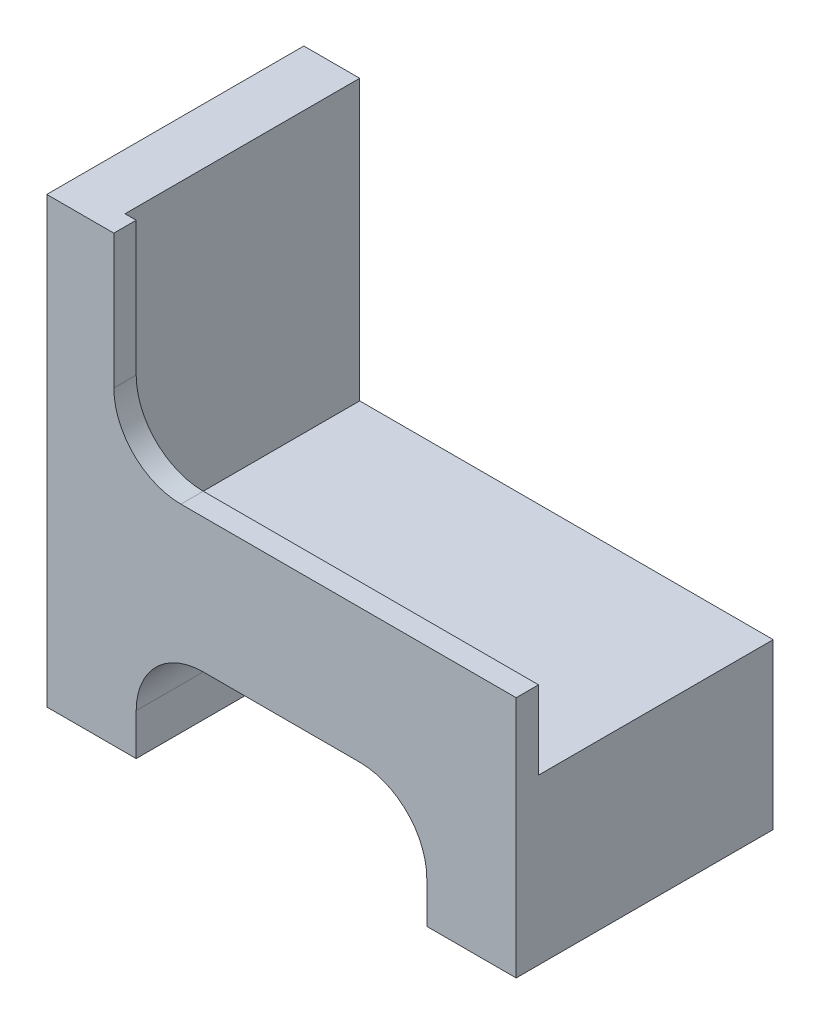
ISO-10303-21;
HEADER;
FILE_DESCRIPTION(('STEP AP214'),'2;1');
FILE_NAME('part.step','',(''),(''),'','','');
FILE_SCHEMA(('AUTOMOTIVE_DESIGN { 1 0 10303 214 1 1 1 1 }'));
ENDSEC;
DATA;
#1=APPLICATION_CONTEXT('core data for automotive mechanical design processes');
#2=APPLICATION_PROTOCOL_DEFINITION('international standard','automotive_design',2000,#1);
#3=PRODUCT_CONTEXT('',#1,'mechanical');
#4=PRODUCT('Part','Part','',(#3));
#5=PRODUCT_RELATED_PRODUCT_CATEGORY('part','',(#4));
#6=PRODUCT_DEFINITION_FORMATION('','',#4);
#7=PRODUCT_DEFINITION_CONTEXT('part definition',#1,'design');
#8=PRODUCT_DEFINITION('design','',#6,#7);
#9=PRODUCT_DEFINITION_SHAPE('','',#8);
#10=(LENGTH_UNIT() NAMED_UNIT(*) SI_UNIT(.MILLI.,.METRE.));
#11=(NAMED_UNIT(*) PLANE_ANGLE_UNIT() SI_UNIT($,.RADIAN.));
#12=(NAMED_UNIT(*) SI_UNIT($,.STERADIAN.) SOLID_ANGLE_UNIT());
#13=UNCERTAINTY_MEASURE_WITH_UNIT(LENGTH_MEASURE(1.E-05),#10,'distance_accuracy_value','');
#14=(GEOMETRIC_REPRESENTATION_CONTEXT(3) GLOBAL_UNCERTAINTY_ASSIGNED_CONTEXT((#13)) GLOBAL_UNIT_ASSIGNED_CONTEXT((#10,
#11,#12)) REPRESENTATION_CONTEXT('',''));
#15=CARTESIAN_POINT('',(0.,0.,0.));
#16=DIRECTION('',(0.,0.,1.));
#17=DIRECTION('',(1.,0.,0.));
#18=AXIS2_PLACEMENT_3D('',#15,#16,#17);
#19=CARTESIAN_POINT('',(0.,0.,10.));
#20=DIRECTION('',(-1.,0.,0.));
#21=DIRECTION('',(0.,0.,1.));
#22=AXIS2_PLACEMENT_3D('',#19,#20,#21);
#23=PLANE('',#22);
#24=DIRECTION('',(0.,-1.,0.));
#25=VECTOR('',#24,1.);
#26=CARTESIAN_POINT('',(0.,0.,10.5));
#27=LINE('',#26,#25);
#28=CARTESIAN_POINT('',(0.,12.,10.5));
#29=VERTEX_POINT('',#28);
#30=CARTESIAN_POINT('',(0.,6.,10.5));
#31=VERTEX_POINT('',#30);
#32=EDGE_CURVE('E57',#29,#31,#27,.T.);
#33=ORIENTED_EDGE('',*,*,#32,.F.);
#34=DIRECTION('',(0.,0.,-1.));
#35=VECTOR('',#34,1.);
#36=CARTESIAN_POINT('',(0.,12.,10.));
#37=LINE('',#36,#35);
#38=CARTESIAN_POINT('',(0.,12.,11.5));
#39=VERTEX_POINT('',#38);
#40=EDGE_CURVE('E303',#39,#29,#37,.T.);
#41=ORIENTED_EDGE('',*,*,#40,.F.);
#42=DIRECTION('',(0.,1.,0.));
#43=VECTOR('',#42,1.);
#44=CARTESIAN_POINT('',(0.,12.,11.5));
#45=LINE('',#44,#43);
#46=CARTESIAN_POINT('',(0.,6.,11.5));
#47=VERTEX_POINT('',#46);
#48=EDGE_CURVE('E241',#47,#39,#45,.T.);
#49=ORIENTED_EDGE('',*,*,#48,.F.);
#50=DIRECTION('',(0.,0.,-1.));
#51=VECTOR('',#50,1.);
#52=CARTESIAN_POINT('',(0.,6.,10.));
#53=LINE('',#52,#51);
#54=EDGE_CURVE('E343',#47,#31,#53,.T.);
#55=ORIENTED_EDGE('',*,*,#54,.T.);
#56=EDGE_LOOP('',(#33,#41,#49,#55));
#57=FACE_BOUND('',#56,.T.);
#58=ADVANCED_FACE('F41',(#57),#23,.F.);
#59=CARTESIAN_POINT('',(0.,3.,11.5));
#60=DIRECTION('',(0.,-1.,0.));
#61=DIRECTION('',(1.,0.,0.));
#62=AXIS2_PLACEMENT_3D('',#59,#60,#61);
#63=PLANE('',#62);
#64=DIRECTION('',(1.,0.,0.));
#65=VECTOR('',#64,1.);
#66=CARTESIAN_POINT('',(0.,3.,10.5));
#67=LINE('',#66,#65);
#68=CARTESIAN_POINT('',(3.,3.,10.5));
#69=VERTEX_POINT('',#68);
#70=CARTESIAN_POINT('',(18.,3.,10.5));
#71=VERTEX_POINT('',#70);
#72=EDGE_CURVE('E174',#69,#71,#67,.T.);
#73=ORIENTED_EDGE('',*,*,#72,.F.);
#74=DIRECTION('',(0.,0.,-1.));
#75=VECTOR('',#74,1.);
#76=CARTESIAN_POINT('',(3.,3.,11.5));
#77=LINE('',#76,#75);
#78=CARTESIAN_POINT('',(3.,3.,11.5));
#79=VERTEX_POINT('',#78);
#80=EDGE_CURVE('E65',#69,#79,#77,.F.);
#81=ORIENTED_EDGE('',*,*,#80,.T.);
#82=DIRECTION('',(-1.,0.,0.));
#83=VECTOR('',#82,1.);
#84=CARTESIAN_POINT('',(0.,3.,11.5));
#85=LINE('',#84,#83);
#86=CARTESIAN_POINT('',(18.,3.,11.5));
#87=VERTEX_POINT('',#86);
#88=EDGE_CURVE('E238',#87,#79,#85,.T.);
#89=ORIENTED_EDGE('',*,*,#88,.F.);
#90=DIRECTION('',(0.,0.,-1.));
#91=VECTOR('',#90,1.);
#92=CARTESIAN_POINT('',(18.,3.,11.5));
#93=LINE('',#92,#91);
#94=EDGE_CURVE('E244',#87,#71,#93,.T.);
#95=ORIENTED_EDGE('',*,*,#94,.T.);
#96=EDGE_LOOP('',(#73,#81,#89,#95));
#97=FACE_BOUND('',#96,.T.);
#98=ADVANCED_FACE('F354',(#97),#63,.F.);
#99=CARTESIAN_POINT('',(3.,6.,10.));
#100=DIRECTION('',(0.,0.,1.));
#101=DIRECTION('',(1.,0.,0.));
#102=AXIS2_PLACEMENT_3D('',#99,#100,#101);
#103=CYLINDRICAL_SURFACE('',#102,3.);
#104=CARTESIAN_POINT('',(3.,6.,10.5));
#105=DIRECTION('',(0.,0.,-1.));
#106=DIRECTION('',(-1.,0.,0.));
#107=AXIS2_PLACEMENT_3D('',#104,#105,#106);
#108=CIRCLE('',#107,3.);
#109=EDGE_CURVE('E50',#31,#69,#108,.F.);
#110=ORIENTED_EDGE('',*,*,#109,.F.);
#111=ORIENTED_EDGE('',*,*,#54,.F.);
#112=CARTESIAN_POINT('',(3.,6.,11.5));
#113=DIRECTION('',(0.,0.,1.));
#114=DIRECTION('',(1.,0.,0.));
#115=AXIS2_PLACEMENT_3D('',#112,#113,#114);
#116=CIRCLE('',#115,3.);
#117=EDGE_CURVE('E349',#79,#47,#116,.F.);
#118=ORIENTED_EDGE('',*,*,#117,.F.);
#119=ORIENTED_EDGE('',*,*,#80,.F.);
#120=EDGE_LOOP('',(#110,#111,#118,#119));
#121=FACE_BOUND('',#120,.T.);
#122=ADVANCED_FACE('F43',(#121),#103,.F.);
#123=CARTESIAN_POINT('',(0.,12.,10.));
#124=DIRECTION('',(0.,-1.,0.));
#125=DIRECTION('',(0.,0.,-1.));
#126=AXIS2_PLACEMENT_3D('',#123,#124,#125);
#127=PLANE('',#126);
#128=DIRECTION('',(1.,0.,0.));
#129=VECTOR('',#128,1.);
#130=CARTESIAN_POINT('',(0.,12.,10.5));
#131=LINE('',#130,#129);
#132=CARTESIAN_POINT('',(-0.5,12.,10.5));
#133=VERTEX_POINT('',#132);
#134=EDGE_CURVE('E191',#133,#29,#131,.T.);
#135=ORIENTED_EDGE('',*,*,#134,.F.);
#136=DIRECTION('',(0.,0.,-1.));
#137=VECTOR('',#136,1.);
#138=CARTESIAN_POINT('',(-0.5,12.,10.));
#139=LINE('',#138,#137);
#140=CARTESIAN_POINT('',(-0.5,12.,0.));
#141=VERTEX_POINT('',#140);
#142=EDGE_CURVE('E178',#133,#141,#139,.T.);
#143=ORIENTED_EDGE('',*,*,#142,.T.);
#144=DIRECTION('',(-1.,0.,0.));
#145=VECTOR('',#144,1.);
#146=CARTESIAN_POINT('',(0.,12.,0.));
#147=LINE('',#146,#145);
#148=CARTESIAN_POINT('',(-3.,12.,0.));
#149=VERTEX_POINT('',#148);
#150=EDGE_CURVE('E253',#141,#149,#147,.T.);
#151=ORIENTED_EDGE('',*,*,#150,.T.);
#152=DIRECTION('',(0.,0.,-1.));
#153=VECTOR('',#152,1.);
#154=CARTESIAN_POINT('',(-3.,12.,10.));
#155=LINE('',#154,#153);
#156=CARTESIAN_POINT('',(-3.,12.,11.5));
#157=VERTEX_POINT('',#156);
#158=EDGE_CURVE('E299',#157,#149,#155,.T.);
#159=ORIENTED_EDGE('',*,*,#158,.F.);
#160=DIRECTION('',(-1.,0.,0.));
#161=VECTOR('',#160,1.);
#162=CARTESIAN_POINT('',(0.,12.,11.5));
#163=LINE('',#162,#161);
#164=EDGE_CURVE('E199',#39,#157,#163,.T.);
#165=ORIENTED_EDGE('',*,*,#164,.F.);
#166=ORIENTED_EDGE('',*,*,#40,.T.);
#167=EDGE_LOOP('',(#135,#143,#151,#159,#165,#166));
#168=FACE_BOUND('',#167,.T.);
#169=ADVANCED_FACE('F364',(#168),#127,.F.);
#170=CARTESIAN_POINT('',(-3.,12.,10.));
#171=DIRECTION('',(1.,0.,0.));
#172=DIRECTION('',(0.,1.,0.));
#173=AXIS2_PLACEMENT_3D('',#170,#171,#172);
#174=PLANE('',#173);
#175=DIRECTION('',(0.,-1.,0.));
#176=VECTOR('',#175,1.);
#177=CARTESIAN_POINT('',(-3.,12.,0.));
#178=LINE('',#177,#176);
#179=CARTESIAN_POINT('',(-3.,-7.86,0.));
#180=VERTEX_POINT('',#179);
#181=EDGE_CURVE('E259',#149,#180,#178,.T.);
#182=ORIENTED_EDGE('',*,*,#181,.T.);
#183=DIRECTION('',(0.,0.,-1.));
#184=VECTOR('',#183,1.);
#185=CARTESIAN_POINT('',(-3.,-7.86,10.));
#186=LINE('',#185,#184);
#187=CARTESIAN_POINT('',(-3.,-7.86,11.5));
#188=VERTEX_POINT('',#187);
#189=EDGE_CURVE('E295',#188,#180,#186,.T.);
#190=ORIENTED_EDGE('',*,*,#189,.F.);
#191=DIRECTION('',(0.,-1.,0.));
#192=VECTOR('',#191,1.);
#193=CARTESIAN_POINT('',(-3.,12.,11.5));
#194=LINE('',#193,#192);
#195=EDGE_CURVE('E203',#157,#188,#194,.T.);
#196=ORIENTED_EDGE('',*,*,#195,.F.);
#197=ORIENTED_EDGE('',*,*,#158,.T.);
#198=EDGE_LOOP('',(#182,#190,#196,#197));
#199=FACE_BOUND('',#198,.T.);
#200=ADVANCED_FACE('F403',(#199),#174,.F.);
#201=CARTESIAN_POINT('',(-3.,-7.86,10.));
#202=DIRECTION('',(0.,1.,0.));
#203=DIRECTION('',(-1.,0.,0.));
#204=AXIS2_PLACEMENT_3D('',#201,#202,#203);
#205=PLANE('',#204);
#206=CARTESIAN_POINT('',(-0.999999999999996,-7.86,5.));
#207=DIRECTION('',(0.,1.,0.));
#208=DIRECTION('',(-1.,0.,0.));
#209=AXIS2_PLACEMENT_3D('',#206,#207,#208);
#210=CIRCLE('',#209,1.95);
#211=CARTESIAN_POINT('',(-2.94999999999999,-7.86,5.));
#212=VERTEX_POINT('',#211);
#213=EDGE_CURVE('E339',#212,#212,#210,.T.);
#214=ORIENTED_EDGE('',*,*,#213,.T.);
#215=EDGE_LOOP('',(#214));
#216=FACE_BOUND('',#215,.T.);
#217=DIRECTION('',(1.,0.,0.));
#218=VECTOR('',#217,1.);
#219=CARTESIAN_POINT('',(-3.,-7.86,0.));
#220=LINE('',#219,#218);
#221=CARTESIAN_POINT('',(1.,-7.86,0.));
#222=VERTEX_POINT('',#221);
#223=EDGE_CURVE('E262',#180,#222,#220,.T.);
#224=ORIENTED_EDGE('',*,*,#223,.T.);
#225=DIRECTION('',(0.,0.,-1.));
#226=VECTOR('',#225,1.);
#227=CARTESIAN_POINT('',(1.,-7.86,10.));
#228=LINE('',#227,#226);
#229=CARTESIAN_POINT('',(1.,-7.86,11.5));
#230=VERTEX_POINT('',#229);
#231=EDGE_CURVE('E291',#230,#222,#228,.T.);
#232=ORIENTED_EDGE('',*,*,#231,.F.);
#233=DIRECTION('',(1.,0.,0.));
#234=VECTOR('',#233,1.);
#235=CARTESIAN_POINT('',(-3.,-7.86,11.5));
#236=LINE('',#235,#234);
#237=EDGE_CURVE('E207',#188,#230,#236,.T.);
#238=ORIENTED_EDGE('',*,*,#237,.F.);
#239=ORIENTED_EDGE('',*,*,#189,.T.);
#240=EDGE_LOOP('',(#224,#232,#238,#239));
#241=FACE_BOUND('',#240,.T.);
#242=ADVANCED_FACE('F370',(#216,#241),#205,.F.);
#243=CARTESIAN_POINT('',(1.,-7.86,10.));
#244=DIRECTION('',(-1.,0.,0.));
#245=DIRECTION('',(0.,-1.,0.));
#246=AXIS2_PLACEMENT_3D('',#243,#244,#245);
#247=PLANE('',#246);
#248=DIRECTION('',(0.,1.,0.));
#249=VECTOR('',#248,1.);
#250=CARTESIAN_POINT('',(1.,-7.86,0.));
#251=LINE('',#250,#249);
#252=CARTESIAN_POINT('',(1.,-6.,0.));
#253=VERTEX_POINT('',#252);
#254=EDGE_CURVE('E265',#222,#253,#251,.T.);
#255=ORIENTED_EDGE('',*,*,#254,.T.);
#256=DIRECTION('',(0.,0.,-1.));
#257=VECTOR('',#256,1.);
#258=CARTESIAN_POINT('',(1.,-6.,10.));
#259=LINE('',#258,#257);
#260=CARTESIAN_POINT('',(1.,-6.,11.5));
#261=VERTEX_POINT('',#260);
#262=EDGE_CURVE('E318',#253,#261,#259,.F.);
#263=ORIENTED_EDGE('',*,*,#262,.T.);
#264=DIRECTION('',(0.,1.,0.));
#265=VECTOR('',#264,1.);
#266=CARTESIAN_POINT('',(1.,-7.86,11.5));
#267=LINE('',#266,#265);
#268=EDGE_CURVE('E211',#230,#261,#267,.T.);
#269=ORIENTED_EDGE('',*,*,#268,.F.);
#270=ORIENTED_EDGE('',*,*,#231,.T.);
#271=EDGE_LOOP('',(#255,#263,#269,#270));
#272=FACE_BOUND('',#271,.T.);
#273=ADVANCED_FACE('F374',(#272),#247,.F.);
#274=CARTESIAN_POINT('',(1.,-3.,10.));
#275=DIRECTION('',(0.,1.,0.));
#276=DIRECTION('',(-1.,0.,0.));
#277=AXIS2_PLACEMENT_3D('',#274,#275,#276);
#278=PLANE('',#277);
#279=DIRECTION('',(1.,0.,0.));
#280=VECTOR('',#279,1.);
#281=CARTESIAN_POINT('',(1.,-3.,0.));
#282=LINE('',#281,#280);
#283=CARTESIAN_POINT('',(4.,-3.,0.));
#284=VERTEX_POINT('',#283);
#285=CARTESIAN_POINT('',(11.,-3.,0.));
#286=VERTEX_POINT('',#285);
#287=EDGE_CURVE('E269',#284,#286,#282,.T.);
#288=ORIENTED_EDGE('',*,*,#287,.T.);
#289=DIRECTION('',(0.,0.,-1.));
#290=VECTOR('',#289,1.);
#291=CARTESIAN_POINT('',(11.,-3.,10.));
#292=LINE('',#291,#290);
#293=CARTESIAN_POINT('',(11.,-3.,11.5));
#294=VERTEX_POINT('',#293);
#295=EDGE_CURVE('E315',#286,#294,#292,.F.);
#296=ORIENTED_EDGE('',*,*,#295,.T.);
#297=DIRECTION('',(1.,0.,0.));
#298=VECTOR('',#297,1.);
#299=CARTESIAN_POINT('',(4.,-3.,11.5));
#300=LINE('',#299,#298);
#301=CARTESIAN_POINT('',(4.,-3.,11.5));
#302=VERTEX_POINT('',#301);
#303=EDGE_CURVE('E219',#302,#294,#300,.T.);
#304=ORIENTED_EDGE('',*,*,#303,.F.);
#305=DIRECTION('',(0.,0.,-1.));
#306=VECTOR('',#305,1.);
#307=CARTESIAN_POINT('',(4.,-3.,0.));
#308=LINE('',#307,#306);
#309=EDGE_CURVE('E311',#302,#284,#308,.T.);
#310=ORIENTED_EDGE('',*,*,#309,.T.);
#311=EDGE_LOOP('',(#288,#296,#304,#310));
#312=FACE_BOUND('',#311,.T.);
#313=ADVANCED_FACE('F386',(#312),#278,.F.);
#314=CARTESIAN_POINT('',(14.,-7.86,10.));
#315=DIRECTION('',(1.,0.,0.));
#316=DIRECTION('',(0.,0.,-1.));
#317=AXIS2_PLACEMENT_3D('',#314,#315,#316);
#318=PLANE('',#317);
#319=DIRECTION('',(0.,0.,-1.));
#320=VECTOR('',#319,1.);
#321=CARTESIAN_POINT('',(14.,-7.86,10.));
#322=LINE('',#321,#320);
#323=CARTESIAN_POINT('',(14.,-7.86,11.5));
#324=VERTEX_POINT('',#323);
#325=CARTESIAN_POINT('',(14.,-7.86,0.));
#326=VERTEX_POINT('',#325);
#327=EDGE_CURVE('E287',#324,#326,#322,.T.);
#328=ORIENTED_EDGE('',*,*,#327,.F.);
#329=DIRECTION('',(0.,-1.,0.));
#330=VECTOR('',#329,1.);
#331=CARTESIAN_POINT('',(14.,-6.,11.5));
#332=LINE('',#331,#330);
#333=CARTESIAN_POINT('',(14.,-6.,11.5));
#334=VERTEX_POINT('',#333);
#335=EDGE_CURVE('E227',#334,#324,#332,.T.);
#336=ORIENTED_EDGE('',*,*,#335,.F.);
#337=DIRECTION('',(0.,0.,-1.));
#338=VECTOR('',#337,1.);
#339=CARTESIAN_POINT('',(14.,-6.,0.));
#340=LINE('',#339,#338);
#341=CARTESIAN_POINT('',(14.,-6.,0.));
#342=VERTEX_POINT('',#341);
#343=EDGE_CURVE('E307',#334,#342,#340,.T.);
#344=ORIENTED_EDGE('',*,*,#343,.T.);
#345=DIRECTION('',(0.,-1.,0.));
#346=VECTOR('',#345,1.);
#347=CARTESIAN_POINT('',(14.,-7.86,0.));
#348=LINE('',#347,#346);
#349=EDGE_CURVE('E273',#342,#326,#348,.T.);
#350=ORIENTED_EDGE('',*,*,#349,.T.);
#351=EDGE_LOOP('',(#328,#336,#344,#350));
#352=FACE_BOUND('',#351,.T.);
#353=ADVANCED_FACE('F394',(#352),#318,.F.);
#354=CARTESIAN_POINT('',(18.,-7.86,10.));
#355=DIRECTION('',(0.,1.,0.));
#356=DIRECTION('',(0.,0.,1.));
#357=AXIS2_PLACEMENT_3D('',#354,#355,#356);
#358=PLANE('',#357);
#359=CARTESIAN_POINT('',(16.,-7.86,5.10136651994786));
#360=DIRECTION('',(0.,1.,0.));
#361=DIRECTION('',(0.,0.,1.));
#362=AXIS2_PLACEMENT_3D('',#359,#360,#361);
#363=CIRCLE('',#362,1.95);
#364=CARTESIAN_POINT('',(16.,-7.86,7.05136651994786));
#365=VERTEX_POINT('',#364);
#366=EDGE_CURVE('E331',#365,#365,#363,.T.);
#367=ORIENTED_EDGE('',*,*,#366,.T.);
#368=EDGE_LOOP('',(#367));
#369=FACE_BOUND('',#368,.T.);
#370=DIRECTION('',(1.,0.,0.));
#371=VECTOR('',#370,1.);
#372=CARTESIAN_POINT('',(18.,-7.86,0.));
#373=LINE('',#372,#371);
#374=CARTESIAN_POINT('',(18.,-7.86,0.));
#375=VERTEX_POINT('',#374);
#376=EDGE_CURVE('E276',#326,#375,#373,.T.);
#377=ORIENTED_EDGE('',*,*,#376,.T.);
#378=DIRECTION('',(0.,0.,-1.));
#379=VECTOR('',#378,1.);
#380=CARTESIAN_POINT('',(18.,-7.86,10.));
#381=LINE('',#380,#379);
#382=CARTESIAN_POINT('',(18.,-7.86,11.5));
#383=VERTEX_POINT('',#382);
#384=EDGE_CURVE('E283',#383,#375,#381,.T.);
#385=ORIENTED_EDGE('',*,*,#384,.F.);
#386=DIRECTION('',(1.,0.,0.));
#387=VECTOR('',#386,1.);
#388=CARTESIAN_POINT('',(14.,-7.86,11.5));
#389=LINE('',#388,#387);
#390=EDGE_CURVE('E231',#324,#383,#389,.T.);
#391=ORIENTED_EDGE('',*,*,#390,.F.);
#392=ORIENTED_EDGE('',*,*,#327,.T.);
#393=EDGE_LOOP('',(#377,#385,#391,#392));
#394=FACE_BOUND('',#393,.T.);
#395=ADVANCED_FACE('F398',(#369,#394),#358,.F.);
#396=CARTESIAN_POINT('',(18.,-7.86,10.));
#397=DIRECTION('',(-1.,0.,0.));
#398=DIRECTION('',(0.,0.,1.));
#399=AXIS2_PLACEMENT_3D('',#396,#397,#398);
#400=PLANE('',#399);
#401=DIRECTION('',(0.,1.,0.));
#402=VECTOR('',#401,1.);
#403=CARTESIAN_POINT('',(18.,-7.86,0.));
#404=LINE('',#403,#402);
#405=CARTESIAN_POINT('',(18.,-0.500000000000002,0.));
#406=VERTEX_POINT('',#405);
#407=EDGE_CURVE('E279',#375,#406,#404,.T.);
#408=ORIENTED_EDGE('',*,*,#407,.T.);
#409=DIRECTION('',(0.,0.,1.));
#410=VECTOR('',#409,1.);
#411=CARTESIAN_POINT('',(18.,-0.500000000000003,10.));
#412=LINE('',#411,#410);
#413=CARTESIAN_POINT('',(18.,-0.500000000000002,10.5));
#414=VERTEX_POINT('',#413);
#415=EDGE_CURVE('E194',#406,#414,#412,.T.);
#416=ORIENTED_EDGE('',*,*,#415,.T.);
#417=DIRECTION('',(0.,-1.,0.));
#418=VECTOR('',#417,1.);
#419=CARTESIAN_POINT('',(18.,-7.86,10.5));
#420=LINE('',#419,#418);
#421=EDGE_CURVE('E163',#71,#414,#420,.T.);
#422=ORIENTED_EDGE('',*,*,#421,.F.);
#423=ORIENTED_EDGE('',*,*,#94,.F.);
#424=DIRECTION('',(0.,1.,0.));
#425=VECTOR('',#424,1.);
#426=CARTESIAN_POINT('',(18.,-7.86,11.5));
#427=LINE('',#426,#425);
#428=EDGE_CURVE('E235',#383,#87,#427,.T.);
#429=ORIENTED_EDGE('',*,*,#428,.F.);
#430=ORIENTED_EDGE('',*,*,#384,.T.);
#431=EDGE_LOOP('',(#408,#416,#422,#423,#429,#430));
#432=FACE_BOUND('',#431,.T.);
#433=ADVANCED_FACE('F402',(#432),#400,.F.);
#434=CARTESIAN_POINT('',(0.,0.,0.));
#435=DIRECTION('',(0.,0.,1.));
#436=DIRECTION('',(1.,0.,0.));
#437=AXIS2_PLACEMENT_3D('',#434,#435,#436);
#438=PLANE('',#437);
#439=ORIENTED_EDGE('',*,*,#150,.F.);
#440=DIRECTION('',(0.,1.,0.));
#441=VECTOR('',#440,1.);
#442=CARTESIAN_POINT('',(-0.5,-0.5,0.));
#443=LINE('',#442,#441);
#444=CARTESIAN_POINT('',(-0.5,-0.5,0.));
#445=VERTEX_POINT('',#444);
#446=EDGE_CURVE('E180',#445,#141,#443,.T.);
#447=ORIENTED_EDGE('',*,*,#446,.F.);
#448=DIRECTION('',(1.,0.,0.));
#449=VECTOR('',#448,1.);
#450=CARTESIAN_POINT('',(0.,-0.5,0.));
#451=LINE('',#450,#449);
#452=EDGE_CURVE('E11',#445,#406,#451,.T.);
#453=ORIENTED_EDGE('',*,*,#452,.T.);
#454=ORIENTED_EDGE('',*,*,#407,.F.);
#455=ORIENTED_EDGE('',*,*,#376,.F.);
#456=ORIENTED_EDGE('',*,*,#349,.F.);
#457=CARTESIAN_POINT('',(11.,-6.,0.));
#458=DIRECTION('',(0.,0.,1.));
#459=DIRECTION('',(1.,0.,0.));
#460=AXIS2_PLACEMENT_3D('',#457,#458,#459);
#461=CIRCLE('',#460,3.);
#462=EDGE_CURVE('E321',#342,#286,#461,.T.);
#463=ORIENTED_EDGE('',*,*,#462,.T.);
#464=ORIENTED_EDGE('',*,*,#287,.F.);
#465=CARTESIAN_POINT('',(4.,-6.,0.));
#466=DIRECTION('',(0.,0.,1.));
#467=DIRECTION('',(1.,0.,0.));
#468=AXIS2_PLACEMENT_3D('',#465,#466,#467);
#469=CIRCLE('',#468,3.);
#470=EDGE_CURVE('E324',#284,#253,#469,.T.);
#471=ORIENTED_EDGE('',*,*,#470,.T.);
#472=ORIENTED_EDGE('',*,*,#254,.F.);
#473=ORIENTED_EDGE('',*,*,#223,.F.);
#474=ORIENTED_EDGE('',*,*,#181,.F.);
#475=EDGE_LOOP('',(#439,#447,#453,#454,#455,#456,#463,#464,#471,#472,#473,#474));
#476=FACE_BOUND('',#475,.T.);
#477=ADVANCED_FACE('F378',(#476),#438,.F.);
#478=CARTESIAN_POINT('',(16.,-2.85999999999999,5.10136651994786));
#479=DIRECTION('',(0.,-1.,0.));
#480=DIRECTION('',(1.,0.,0.));
#481=AXIS2_PLACEMENT_3D('',#478,#479,#480);
#482=CYLINDRICAL_SURFACE('',#481,0.950000000000001);
#483=CARTESIAN_POINT('',(16.,-6.86000000000001,5.10136651994786));
#484=DIRECTION('',(0.,1.,0.));
#485=DIRECTION('',(0.,0.,1.));
#486=AXIS2_PLACEMENT_3D('',#483,#484,#485);
#487=CIRCLE('',#486,0.950000000000001);
#488=CARTESIAN_POINT('',(16.,-6.86000000000001,6.05136651994786));
#489=VERTEX_POINT('',#488);
#490=EDGE_CURVE('E327',#489,#489,#487,.F.);
#491=ORIENTED_EDGE('',*,*,#490,.T.);
#492=EDGE_LOOP('',(#491));
#493=FACE_BOUND('',#492,.T.);
#494=CARTESIAN_POINT('',(16.,-2.85999999999999,5.10136651994786));
#495=DIRECTION('',(0.,-1.,0.));
#496=DIRECTION('',(1.,0.,0.));
#497=AXIS2_PLACEMENT_3D('',#494,#495,#496);
#498=CIRCLE('',#497,0.950000000000001);
#499=CARTESIAN_POINT('',(16.95,-2.85999999999999,5.10136651994786));
#500=VERTEX_POINT('',#499);
#501=EDGE_CURVE('E248',#500,#500,#498,.T.);
#502=ORIENTED_EDGE('',*,*,#501,.F.);
#503=EDGE_LOOP('',(#502));
#504=FACE_BOUND('',#503,.T.);
#505=ADVANCED_FACE('F459',(#493,#504),#482,.F.);
#506=CARTESIAN_POINT('',(16.,-2.85999999999999,5.10136651994786));
#507=DIRECTION('',(0.,-1.,0.));
#508=DIRECTION('',(1.,0.,0.));
#509=AXIS2_PLACEMENT_3D('',#506,#507,#508);
#510=PLANE('',#509);
#511=ORIENTED_EDGE('',*,*,#501,.T.);
#512=EDGE_LOOP('',(#511));
#513=FACE_BOUND('',#512,.T.);
#514=ADVANCED_FACE('F448',(#513),#510,.T.);
#515=CARTESIAN_POINT('',(-0.999999999999998,-2.86,5.));
#516=DIRECTION('',(0.,-1.,0.));
#517=DIRECTION('',(1.,0.,0.));
#518=AXIS2_PLACEMENT_3D('',#515,#516,#517);
#519=CYLINDRICAL_SURFACE('',#518,0.95);
#520=CARTESIAN_POINT('',(-0.999999999999997,-6.86000000000001,5.));
#521=DIRECTION('',(0.,1.,0.));
#522=DIRECTION('',(-1.,0.,0.));
#523=AXIS2_PLACEMENT_3D('',#520,#521,#522);
#524=CIRCLE('',#523,0.95);
#525=CARTESIAN_POINT('',(-1.95,-6.86000000000001,5.));
#526=VERTEX_POINT('',#525);
#527=EDGE_CURVE('E335',#526,#526,#524,.F.);
#528=ORIENTED_EDGE('',*,*,#527,.T.);
#529=EDGE_LOOP('',(#528));
#530=FACE_BOUND('',#529,.T.);
#531=CARTESIAN_POINT('',(-0.999999999999998,-2.86,5.));
#532=DIRECTION('',(0.,-1.,0.));
#533=DIRECTION('',(1.,0.,0.));
#534=AXIS2_PLACEMENT_3D('',#531,#532,#533);
#535=CIRCLE('',#534,0.95);
#536=CARTESIAN_POINT('',(-0.0499999999999982,-2.86,5.));
#537=VERTEX_POINT('',#536);
#538=EDGE_CURVE('E249',#537,#537,#535,.T.);
#539=ORIENTED_EDGE('',*,*,#538,.F.);
#540=EDGE_LOOP('',(#539));
#541=FACE_BOUND('',#540,.T.);
#542=ADVANCED_FACE('F445',(#530,#541),#519,.F.);
#543=CARTESIAN_POINT('',(-0.999999999999998,-2.86,5.));
#544=DIRECTION('',(0.,-1.,0.));
#545=DIRECTION('',(1.,0.,0.));
#546=AXIS2_PLACEMENT_3D('',#543,#544,#545);
#547=PLANE('',#546);
#548=ORIENTED_EDGE('',*,*,#538,.T.);
#549=EDGE_LOOP('',(#548));
#550=FACE_BOUND('',#549,.T.);
#551=ADVANCED_FACE('F423',(#550),#547,.T.);
#552=CARTESIAN_POINT('',(11.,-6.,10.));
#553=DIRECTION('',(0.,0.,1.));
#554=DIRECTION('',(1.,0.,0.));
#555=AXIS2_PLACEMENT_3D('',#552,#553,#554);
#556=CYLINDRICAL_SURFACE('',#555,3.);
#557=ORIENTED_EDGE('',*,*,#343,.F.);
#558=CARTESIAN_POINT('',(11.,-6.,11.5));
#559=DIRECTION('',(0.,0.,-1.));
#560=DIRECTION('',(1.,0.,0.));
#561=AXIS2_PLACEMENT_3D('',#558,#559,#560);
#562=CIRCLE('',#561,3.);
#563=EDGE_CURVE('E223',#294,#334,#562,.T.);
#564=ORIENTED_EDGE('',*,*,#563,.F.);
#565=ORIENTED_EDGE('',*,*,#295,.F.);
#566=ORIENTED_EDGE('',*,*,#462,.F.);
#567=EDGE_LOOP('',(#557,#564,#565,#566));
#568=FACE_BOUND('',#567,.T.);
#569=ADVANCED_FACE('F391',(#568),#556,.F.);
#570=CARTESIAN_POINT('',(4.,-6.,10.));
#571=DIRECTION('',(0.,0.,1.));
#572=DIRECTION('',(1.,0.,0.));
#573=AXIS2_PLACEMENT_3D('',#570,#571,#572);
#574=CYLINDRICAL_SURFACE('',#573,3.);
#575=ORIENTED_EDGE('',*,*,#309,.F.);
#576=CARTESIAN_POINT('',(4.,-6.,11.5));
#577=DIRECTION('',(0.,0.,-1.));
#578=DIRECTION('',(1.,0.,0.));
#579=AXIS2_PLACEMENT_3D('',#576,#577,#578);
#580=CIRCLE('',#579,3.);
#581=EDGE_CURVE('E215',#261,#302,#580,.T.);
#582=ORIENTED_EDGE('',*,*,#581,.F.);
#583=ORIENTED_EDGE('',*,*,#262,.F.);
#584=ORIENTED_EDGE('',*,*,#470,.F.);
#585=EDGE_LOOP('',(#575,#582,#583,#584));
#586=FACE_BOUND('',#585,.T.);
#587=ADVANCED_FACE('F382',(#586),#574,.F.);
#588=CARTESIAN_POINT('',(16.,-6.86000000000001,5.10136651994786));
#589=DIRECTION('',(0.,-1.,0.));
#590=DIRECTION('',(0.,0.,-1.));
#591=AXIS2_PLACEMENT_3D('',#588,#589,#590);
#592=CONICAL_SURFACE('',#591,0.950000000000001,0.785398163397452);
#593=ORIENTED_EDGE('',*,*,#366,.F.);
#594=EDGE_LOOP('',(#593));
#595=FACE_BOUND('',#594,.T.);
#596=ORIENTED_EDGE('',*,*,#490,.F.);
#597=EDGE_LOOP('',(#596));
#598=FACE_BOUND('',#597,.T.);
#599=ADVANCED_FACE('F426',(#595,#598),#592,.F.);
#600=CARTESIAN_POINT('',(-0.999999999999997,-6.86000000000001,5.));
#601=DIRECTION('',(0.,-1.,0.));
#602=DIRECTION('',(1.,0.,0.));
#603=AXIS2_PLACEMENT_3D('',#600,#601,#602);
#604=CONICAL_SURFACE('',#603,0.95,0.785398163397448);
#605=ORIENTED_EDGE('',*,*,#213,.F.);
#606=EDGE_LOOP('',(#605));
#607=FACE_BOUND('',#606,.T.);
#608=ORIENTED_EDGE('',*,*,#527,.F.);
#609=EDGE_LOOP('',(#608));
#610=FACE_BOUND('',#609,.T.);
#611=ADVANCED_FACE('F432',(#607,#610),#604,.F.);
#612=CARTESIAN_POINT('',(4.,-6.,11.5));
#613=DIRECTION('',(0.,0.,1.));
#614=DIRECTION('',(1.,0.,0.));
#615=AXIS2_PLACEMENT_3D('',#612,#613,#614);
#616=PLANE('',#615);
#617=ORIENTED_EDGE('',*,*,#164,.T.);
#618=ORIENTED_EDGE('',*,*,#195,.T.);
#619=ORIENTED_EDGE('',*,*,#237,.T.);
#620=ORIENTED_EDGE('',*,*,#268,.T.);
#621=ORIENTED_EDGE('',*,*,#581,.T.);
#622=ORIENTED_EDGE('',*,*,#303,.T.);
#623=ORIENTED_EDGE('',*,*,#563,.T.);
#624=ORIENTED_EDGE('',*,*,#335,.T.);
#625=ORIENTED_EDGE('',*,*,#390,.T.);
#626=ORIENTED_EDGE('',*,*,#428,.T.);
#627=ORIENTED_EDGE('',*,*,#88,.T.);
#628=ORIENTED_EDGE('',*,*,#117,.T.);
#629=ORIENTED_EDGE('',*,*,#48,.T.);
#630=EDGE_LOOP('',(#617,#618,#619,#620,#621,#622,#623,#624,#625,#626,#627,#628,#629));
#631=FACE_BOUND('',#630,.T.);
#632=ADVANCED_FACE('F359',(#631),#616,.T.);
#633=CARTESIAN_POINT('',(-0.5,-0.5,10.5));
#634=DIRECTION('',(-1.,0.,0.));
#635=DIRECTION('',(0.,0.,1.));
#636=AXIS2_PLACEMENT_3D('',#633,#634,#635);
#637=PLANE('',#636);
#638=DIRECTION('',(0.,1.,0.));
#639=VECTOR('',#638,1.);
#640=CARTESIAN_POINT('',(-0.5,-0.5,10.5));
#641=LINE('',#640,#639);
#642=CARTESIAN_POINT('',(-0.5,-0.5,10.5));
#643=VERTEX_POINT('',#642);
#644=EDGE_CURVE('E160',#643,#133,#641,.T.);
#645=ORIENTED_EDGE('',*,*,#644,.F.);
#646=DIRECTION('',(0.,0.,-1.));
#647=VECTOR('',#646,1.);
#648=CARTESIAN_POINT('',(-0.5,-0.5,10.5));
#649=LINE('',#648,#647);
#650=EDGE_CURVE('E167',#643,#445,#649,.T.);
#651=ORIENTED_EDGE('',*,*,#650,.T.);
#652=ORIENTED_EDGE('',*,*,#446,.T.);
#653=ORIENTED_EDGE('',*,*,#142,.F.);
#654=EDGE_LOOP('',(#645,#651,#652,#653));
#655=FACE_BOUND('',#654,.T.);
#656=ADVANCED_FACE('F176',(#655),#637,.F.);
#657=CARTESIAN_POINT('',(-0.5,-0.5,10.5));
#658=DIRECTION('',(0.,-1.,0.));
#659=DIRECTION('',(1.,0.,0.));
#660=AXIS2_PLACEMENT_3D('',#657,#658,#659);
#661=PLANE('',#660);
#662=ORIENTED_EDGE('',*,*,#452,.F.);
#663=ORIENTED_EDGE('',*,*,#650,.F.);
#664=DIRECTION('',(-1.,0.,0.));
#665=VECTOR('',#664,1.);
#666=CARTESIAN_POINT('',(-0.5,-0.5,10.5));
#667=LINE('',#666,#665);
#668=EDGE_CURVE('E156',#414,#643,#667,.T.);
#669=ORIENTED_EDGE('',*,*,#668,.F.);
#670=ORIENTED_EDGE('',*,*,#415,.F.);
#671=EDGE_LOOP('',(#662,#663,#669,#670));
#672=FACE_BOUND('',#671,.T.);
#673=ADVANCED_FACE('F170',(#672),#661,.F.);
#674=CARTESIAN_POINT('',(0.,0.,10.5));
#675=DIRECTION('',(0.,0.,-1.));
#676=DIRECTION('',(-1.,0.,0.));
#677=AXIS2_PLACEMENT_3D('',#674,#675,#676);
#678=PLANE('',#677);
#679=ORIENTED_EDGE('',*,*,#134,.T.);
#680=ORIENTED_EDGE('',*,*,#32,.T.);
#681=ORIENTED_EDGE('',*,*,#109,.T.);
#682=ORIENTED_EDGE('',*,*,#72,.T.);
#683=ORIENTED_EDGE('',*,*,#421,.T.);
#684=ORIENTED_EDGE('',*,*,#668,.T.);
#685=ORIENTED_EDGE('',*,*,#644,.T.);
#686=EDGE_LOOP('',(#679,#680,#681,#682,#683,#684,#685));
#687=FACE_BOUND('',#686,.T.);
#688=ADVANCED_FACE('F158',(#687),#678,.T.);
#689=CLOSED_SHELL('',(#58,#98,#122,#169,#200,#242,#273,#313,#353,#395,#433,#477,#505,#514,#542,
#551,#569,#587,#599,#611,#632,#656,#673,#688));
#690=MANIFOLD_SOLID_BREP('B2',#689);
#691=ADVANCED_BREP_SHAPE_REPRESENTATION('',(#18,#690),#14);
#692=SHAPE_DEFINITION_REPRESENTATION(#9,#691);
ENDSEC;
END-ISO-10303-21;
